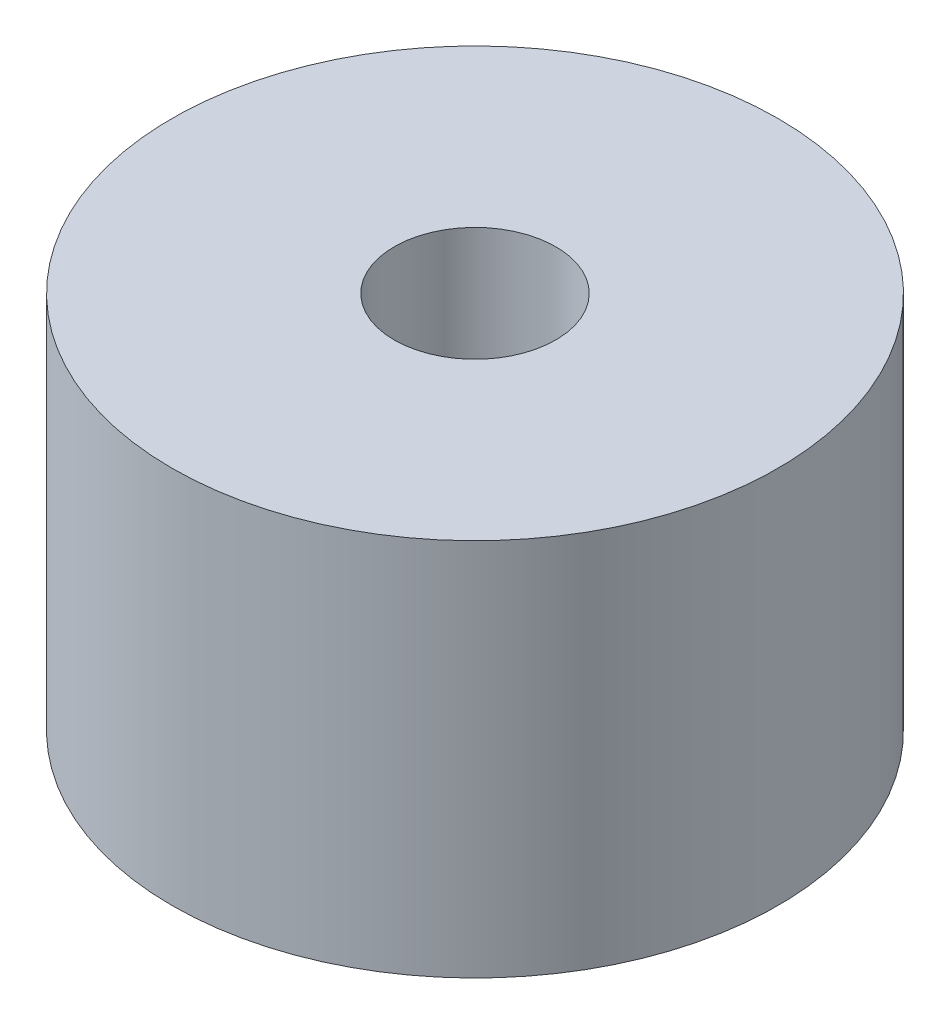
ISO-10303-21;
HEADER;
FILE_DESCRIPTION(('STEP AP214'),'2;1');
FILE_NAME('part.step','',(''),(''),'','','');
FILE_SCHEMA(('AUTOMOTIVE_DESIGN { 1 0 10303 214 1 1 1 1 }'));
ENDSEC;
DATA;
#1=APPLICATION_CONTEXT('core data for automotive mechanical design processes');
#2=APPLICATION_PROTOCOL_DEFINITION('international standard','automotive_design',2000,#1);
#3=PRODUCT_CONTEXT('',#1,'mechanical');
#4=PRODUCT('Part','Part','',(#3));
#5=PRODUCT_RELATED_PRODUCT_CATEGORY('part','',(#4));
#6=PRODUCT_DEFINITION_FORMATION('','',#4);
#7=PRODUCT_DEFINITION_CONTEXT('part definition',#1,'design');
#8=PRODUCT_DEFINITION('design','',#6,#7);
#9=PRODUCT_DEFINITION_SHAPE('','',#8);
#10=(LENGTH_UNIT() NAMED_UNIT(*) SI_UNIT(.MILLI.,.METRE.));
#11=(NAMED_UNIT(*) PLANE_ANGLE_UNIT() SI_UNIT($,.RADIAN.));
#12=(NAMED_UNIT(*) SI_UNIT($,.STERADIAN.) SOLID_ANGLE_UNIT());
#13=UNCERTAINTY_MEASURE_WITH_UNIT(LENGTH_MEASURE(1.E-05),#10,'distance_accuracy_value','');
#14=(GEOMETRIC_REPRESENTATION_CONTEXT(3) GLOBAL_UNCERTAINTY_ASSIGNED_CONTEXT((#13)) GLOBAL_UNIT_ASSIGNED_CONTEXT((#10,
#11,#12)) REPRESENTATION_CONTEXT('',''));
#15=CARTESIAN_POINT('',(0.,0.,0.));
#16=DIRECTION('',(0.,0.,1.));
#17=DIRECTION('',(1.,0.,0.));
#18=AXIS2_PLACEMENT_3D('',#15,#16,#17);
#19=CARTESIAN_POINT('',(0.,7.5,0.));
#20=DIRECTION('',(0.,1.,0.));
#21=DIRECTION('',(0.,0.,1.));
#22=AXIS2_PLACEMENT_3D('',#19,#20,#21);
#23=PLANE('',#22);
#24=CARTESIAN_POINT('',(0.,7.5,0.));
#25=DIRECTION('',(0.,1.,0.));
#26=DIRECTION('',(0.,0.,1.));
#27=AXIS2_PLACEMENT_3D('',#24,#25,#26);
#28=CIRCLE('',#27,6.);
#29=CARTESIAN_POINT('',(0.,7.5,6.));
#30=VERTEX_POINT('',#29);
#31=EDGE_CURVE('E10',#30,#30,#28,.T.);
#32=ORIENTED_EDGE('',*,*,#31,.T.);
#33=EDGE_LOOP('',(#32));
#34=FACE_BOUND('',#33,.T.);
#35=CARTESIAN_POINT('',(0.,7.5,0.));
#36=DIRECTION('',(0.,1.,0.));
#37=DIRECTION('',(0.,0.,1.));
#38=AXIS2_PLACEMENT_3D('',#35,#36,#37);
#39=CIRCLE('',#38,1.6);
#40=CARTESIAN_POINT('',(0.,7.5,1.6));
#41=VERTEX_POINT('',#40);
#42=EDGE_CURVE('E54',#41,#41,#39,.T.);
#43=ORIENTED_EDGE('',*,*,#42,.F.);
#44=EDGE_LOOP('',(#43));
#45=FACE_BOUND('',#44,.T.);
#46=ADVANCED_FACE('F41',(#34,#45),#23,.T.);
#47=CARTESIAN_POINT('',(0.,0.,0.));
#48=DIRECTION('',(0.,1.,0.));
#49=DIRECTION('',(0.,0.,1.));
#50=AXIS2_PLACEMENT_3D('',#47,#48,#49);
#51=PLANE('',#50);
#52=CARTESIAN_POINT('',(0.,0.,0.));
#53=DIRECTION('',(0.,1.,0.));
#54=DIRECTION('',(0.,0.,1.));
#55=AXIS2_PLACEMENT_3D('',#52,#53,#54);
#56=CIRCLE('',#55,6.);
#57=CARTESIAN_POINT('',(0.,0.,6.));
#58=VERTEX_POINT('',#57);
#59=EDGE_CURVE('E45',#58,#58,#56,.T.);
#60=ORIENTED_EDGE('',*,*,#59,.F.);
#61=EDGE_LOOP('',(#60));
#62=FACE_BOUND('',#61,.T.);
#63=CARTESIAN_POINT('',(0.,0.,0.));
#64=DIRECTION('',(0.,1.,0.));
#65=DIRECTION('',(0.,0.,1.));
#66=AXIS2_PLACEMENT_3D('',#63,#64,#65);
#67=CIRCLE('',#66,1.6);
#68=CARTESIAN_POINT('',(0.,0.,1.6));
#69=VERTEX_POINT('',#68);
#70=EDGE_CURVE('E56',#69,#69,#67,.T.);
#71=ORIENTED_EDGE('',*,*,#70,.T.);
#72=EDGE_LOOP('',(#71));
#73=FACE_BOUND('',#72,.T.);
#74=ADVANCED_FACE('F68',(#62,#73),#51,.F.);
#75=CARTESIAN_POINT('',(0.,7.5,0.));
#76=DIRECTION('',(0.,-1.,0.));
#77=DIRECTION('',(0.,0.,-1.));
#78=AXIS2_PLACEMENT_3D('',#75,#76,#77);
#79=CYLINDRICAL_SURFACE('',#78,6.);
#80=ORIENTED_EDGE('',*,*,#31,.F.);
#81=EDGE_LOOP('',(#80));
#82=FACE_BOUND('',#81,.T.);
#83=ORIENTED_EDGE('',*,*,#59,.T.);
#84=EDGE_LOOP('',(#83));
#85=FACE_BOUND('',#84,.T.);
#86=ADVANCED_FACE('F43',(#82,#85),#79,.T.);
#87=CARTESIAN_POINT('',(0.,7.5,0.));
#88=DIRECTION('',(0.,-1.,0.));
#89=DIRECTION('',(0.,0.,-1.));
#90=AXIS2_PLACEMENT_3D('',#87,#88,#89);
#91=CYLINDRICAL_SURFACE('',#90,1.6);
#92=ORIENTED_EDGE('',*,*,#42,.T.);
#93=EDGE_LOOP('',(#92));
#94=FACE_BOUND('',#93,.T.);
#95=ORIENTED_EDGE('',*,*,#70,.F.);
#96=EDGE_LOOP('',(#95));
#97=FACE_BOUND('',#96,.T.);
#98=ADVANCED_FACE('F64',(#94,#97),#91,.F.);
#99=CLOSED_SHELL('',(#46,#74,#86,#98));
#100=MANIFOLD_SOLID_BREP('B2',#99);
#101=ADVANCED_BREP_SHAPE_REPRESENTATION('',(#18,#100),#14);
#102=SHAPE_DEFINITION_REPRESENTATION(#9,#101);
ENDSEC;
END-ISO-10303-21;
